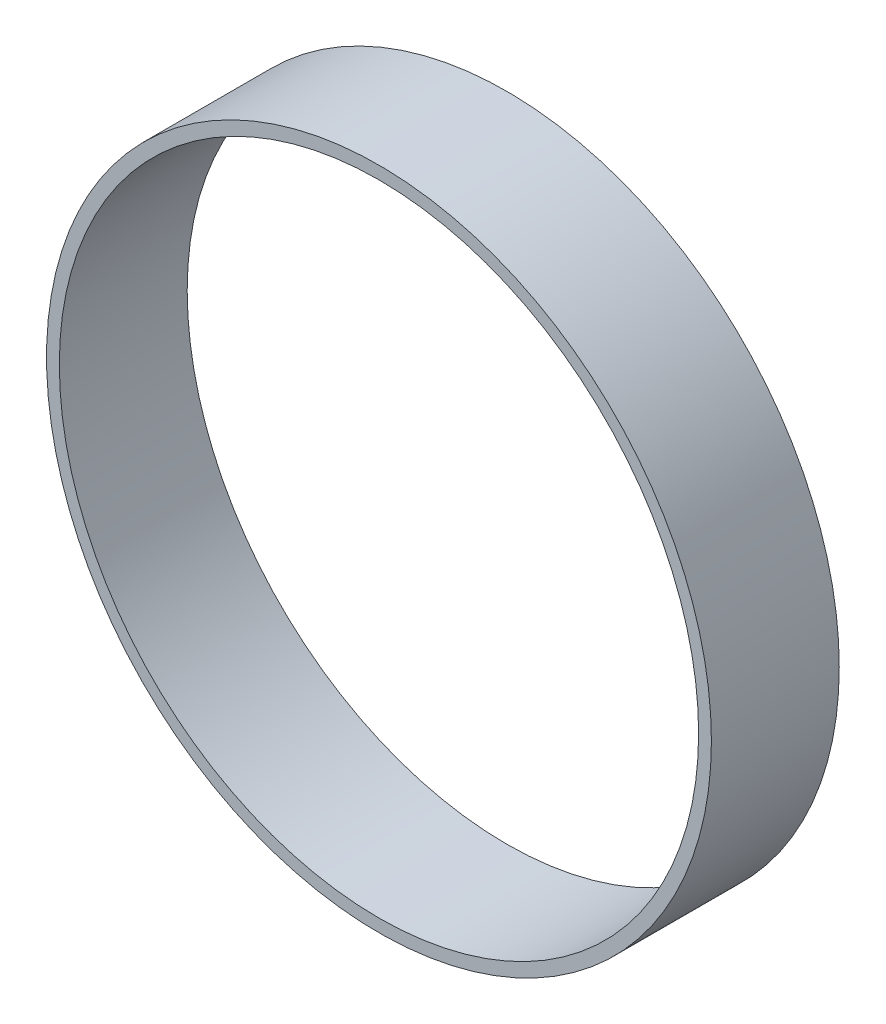
ISO-10303-21;
HEADER;
FILE_DESCRIPTION(('STEP AP214'),'2;1');
FILE_NAME('part.step','',(''),(''),'','','');
FILE_SCHEMA(('AUTOMOTIVE_DESIGN { 1 0 10303 214 1 1 1 1 }'));
ENDSEC;
DATA;
#1=APPLICATION_CONTEXT('core data for automotive mechanical design processes');
#2=APPLICATION_PROTOCOL_DEFINITION('international standard','automotive_design',2000,#1);
#3=PRODUCT_CONTEXT('',#1,'mechanical');
#4=PRODUCT('Part','Part','',(#3));
#5=PRODUCT_RELATED_PRODUCT_CATEGORY('part','',(#4));
#6=PRODUCT_DEFINITION_FORMATION('','',#4);
#7=PRODUCT_DEFINITION_CONTEXT('part definition',#1,'design');
#8=PRODUCT_DEFINITION('design','',#6,#7);
#9=PRODUCT_DEFINITION_SHAPE('','',#8);
#10=(LENGTH_UNIT() NAMED_UNIT(*) SI_UNIT(.MILLI.,.METRE.));
#11=(NAMED_UNIT(*) PLANE_ANGLE_UNIT() SI_UNIT($,.RADIAN.));
#12=(NAMED_UNIT(*) SI_UNIT($,.STERADIAN.) SOLID_ANGLE_UNIT());
#13=UNCERTAINTY_MEASURE_WITH_UNIT(LENGTH_MEASURE(1.E-05),#10,'distance_accuracy_value','');
#14=(GEOMETRIC_REPRESENTATION_CONTEXT(3) GLOBAL_UNCERTAINTY_ASSIGNED_CONTEXT((#13)) GLOBAL_UNIT_ASSIGNED_CONTEXT((#10,
#11,#12)) REPRESENTATION_CONTEXT('',''));
#15=CARTESIAN_POINT('',(0.,0.,0.));
#16=DIRECTION('',(0.,0.,1.));
#17=DIRECTION('',(1.,0.,0.));
#18=AXIS2_PLACEMENT_3D('',#15,#16,#17);
#19=CARTESIAN_POINT('',(0.,0.,10.));
#20=DIRECTION('',(0.,0.,1.));
#21=DIRECTION('',(1.,0.,0.));
#22=AXIS2_PLACEMENT_3D('',#19,#20,#21);
#23=PLANE('',#22);
#24=CARTESIAN_POINT('',(0.,0.,10.));
#25=DIRECTION('',(0.,0.,1.));
#26=DIRECTION('',(1.,0.,0.));
#27=AXIS2_PLACEMENT_3D('',#24,#25,#26);
#28=CIRCLE('',#27,26.);
#29=CARTESIAN_POINT('',(26.,0.,10.));
#30=VERTEX_POINT('',#29);
#31=EDGE_CURVE('E10',#30,#30,#28,.T.);
#32=ORIENTED_EDGE('',*,*,#31,.T.);
#33=EDGE_LOOP('',(#32));
#34=FACE_BOUND('',#33,.T.);
#35=CARTESIAN_POINT('',(0.,0.,10.));
#36=DIRECTION('',(0.,0.,1.));
#37=DIRECTION('',(1.,0.,0.));
#38=AXIS2_PLACEMENT_3D('',#35,#36,#37);
#39=CIRCLE('',#38,25.);
#40=CARTESIAN_POINT('',(25.,0.,10.));
#41=VERTEX_POINT('',#40);
#42=EDGE_CURVE('E46',#41,#41,#39,.T.);
#43=ORIENTED_EDGE('',*,*,#42,.F.);
#44=EDGE_LOOP('',(#43));
#45=FACE_BOUND('',#44,.T.);
#46=ADVANCED_FACE('F35',(#34,#45),#23,.T.);
#47=CARTESIAN_POINT('',(0.,0.,0.));
#48=DIRECTION('',(0.,0.,1.));
#49=DIRECTION('',(1.,0.,0.));
#50=AXIS2_PLACEMENT_3D('',#47,#48,#49);
#51=PLANE('',#50);
#52=CARTESIAN_POINT('',(0.,0.,0.));
#53=DIRECTION('',(0.,0.,1.));
#54=DIRECTION('',(1.,0.,0.));
#55=AXIS2_PLACEMENT_3D('',#52,#53,#54);
#56=CIRCLE('',#55,26.);
#57=CARTESIAN_POINT('',(26.,0.,0.));
#58=VERTEX_POINT('',#57);
#59=EDGE_CURVE('E39',#58,#58,#56,.T.);
#60=ORIENTED_EDGE('',*,*,#59,.F.);
#61=EDGE_LOOP('',(#60));
#62=FACE_BOUND('',#61,.T.);
#63=CARTESIAN_POINT('',(0.,0.,0.));
#64=DIRECTION('',(0.,0.,1.));
#65=DIRECTION('',(1.,0.,0.));
#66=AXIS2_PLACEMENT_3D('',#63,#64,#65);
#67=CIRCLE('',#66,25.);
#68=CARTESIAN_POINT('',(25.,0.,0.));
#69=VERTEX_POINT('',#68);
#70=EDGE_CURVE('E48',#69,#69,#67,.T.);
#71=ORIENTED_EDGE('',*,*,#70,.T.);
#72=EDGE_LOOP('',(#71));
#73=FACE_BOUND('',#72,.T.);
#74=ADVANCED_FACE('F58',(#62,#73),#51,.F.);
#75=CARTESIAN_POINT('',(0.,0.,10.));
#76=DIRECTION('',(0.,0.,-1.));
#77=DIRECTION('',(-1.,0.,0.));
#78=AXIS2_PLACEMENT_3D('',#75,#76,#77);
#79=CYLINDRICAL_SURFACE('',#78,26.);
#80=ORIENTED_EDGE('',*,*,#31,.F.);
#81=EDGE_LOOP('',(#80));
#82=FACE_BOUND('',#81,.T.);
#83=ORIENTED_EDGE('',*,*,#59,.T.);
#84=EDGE_LOOP('',(#83));
#85=FACE_BOUND('',#84,.T.);
#86=ADVANCED_FACE('F37',(#82,#85),#79,.T.);
#87=CARTESIAN_POINT('',(0.,0.,10.));
#88=DIRECTION('',(0.,0.,-1.));
#89=DIRECTION('',(-1.,0.,0.));
#90=AXIS2_PLACEMENT_3D('',#87,#88,#89);
#91=CYLINDRICAL_SURFACE('',#90,25.);
#92=ORIENTED_EDGE('',*,*,#42,.T.);
#93=EDGE_LOOP('',(#92));
#94=FACE_BOUND('',#93,.T.);
#95=ORIENTED_EDGE('',*,*,#70,.F.);
#96=EDGE_LOOP('',(#95));
#97=FACE_BOUND('',#96,.T.);
#98=ADVANCED_FACE('F54',(#94,#97),#91,.F.);
#99=CLOSED_SHELL('',(#46,#74,#86,#98));
#100=MANIFOLD_SOLID_BREP('B2',#99);
#101=ADVANCED_BREP_SHAPE_REPRESENTATION('',(#18,#100),#14);
#102=SHAPE_DEFINITION_REPRESENTATION(#9,#101);
ENDSEC;
END-ISO-10303-21;
